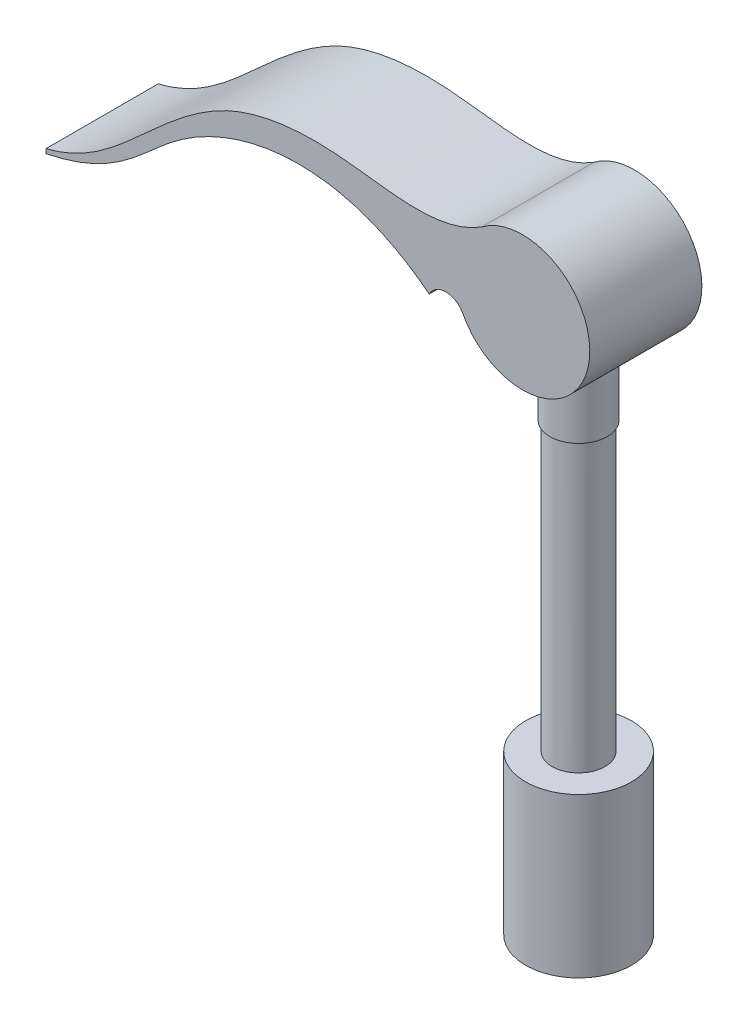
ISO-10303-21;
HEADER;
FILE_DESCRIPTION(('STEP AP214'),'2;1');
FILE_NAME('part.step','',(''),(''),'','','');
FILE_SCHEMA(('AUTOMOTIVE_DESIGN { 1 0 10303 214 1 1 1 1 }'));
ENDSEC;
DATA;
#1=APPLICATION_CONTEXT('core data for automotive mechanical design processes');
#2=APPLICATION_PROTOCOL_DEFINITION('international standard','automotive_design',2000,#1);
#3=PRODUCT_CONTEXT('',#1,'mechanical');
#4=PRODUCT('Part','Part','',(#3));
#5=PRODUCT_RELATED_PRODUCT_CATEGORY('part','',(#4));
#6=PRODUCT_DEFINITION_FORMATION('','',#4);
#7=PRODUCT_DEFINITION_CONTEXT('part definition',#1,'design');
#8=PRODUCT_DEFINITION('design','',#6,#7);
#9=PRODUCT_DEFINITION_SHAPE('','',#8);
#10=(LENGTH_UNIT() NAMED_UNIT(*) SI_UNIT(.MILLI.,.METRE.));
#11=(NAMED_UNIT(*) PLANE_ANGLE_UNIT() SI_UNIT($,.RADIAN.));
#12=(NAMED_UNIT(*) SI_UNIT($,.STERADIAN.) SOLID_ANGLE_UNIT());
#13=UNCERTAINTY_MEASURE_WITH_UNIT(LENGTH_MEASURE(1.E-05),#10,'distance_accuracy_value','');
#14=(GEOMETRIC_REPRESENTATION_CONTEXT(3) GLOBAL_UNCERTAINTY_ASSIGNED_CONTEXT((#13)) GLOBAL_UNIT_ASSIGNED_CONTEXT((#10,
#11,#12)) REPRESENTATION_CONTEXT('',''));
#15=CARTESIAN_POINT('',(0.,0.,0.));
#16=DIRECTION('',(0.,0.,1.));
#17=DIRECTION('',(1.,0.,0.));
#18=AXIS2_PLACEMENT_3D('',#15,#16,#17);
#19=CARTESIAN_POINT('',(0.,32.5,0.));
#20=DIRECTION('',(0.,-1.,0.));
#21=DIRECTION('',(0.,0.,-1.));
#22=AXIS2_PLACEMENT_3D('',#19,#20,#21);
#23=CYLINDRICAL_SURFACE('',#22,3.);
#24=CARTESIAN_POINT('',(0.,18.,0.));
#25=DIRECTION('',(0.,1.,0.));
#26=DIRECTION('',(0.,0.,1.));
#27=AXIS2_PLACEMENT_3D('',#24,#25,#26);
#28=CIRCLE('',#27,3.);
#29=CARTESIAN_POINT('',(0.,18.,3.));
#30=VERTEX_POINT('',#29);
#31=EDGE_CURVE('E47',#30,#30,#28,.T.);
#32=ORIENTED_EDGE('',*,*,#31,.F.);
#33=EDGE_LOOP('',(#32));
#34=FACE_BOUND('',#33,.T.);
#35=CARTESIAN_POINT('',(0.,-14.5,0.));
#36=DIRECTION('',(0.,-1.,0.));
#37=DIRECTION('',(0.,0.,-1.));
#38=AXIS2_PLACEMENT_3D('',#35,#36,#37);
#39=CIRCLE('',#38,3.);
#40=CARTESIAN_POINT('',(0.,-14.5,-3.));
#41=VERTEX_POINT('',#40);
#42=EDGE_CURVE('E11',#41,#41,#39,.T.);
#43=ORIENTED_EDGE('',*,*,#42,.F.);
#44=EDGE_LOOP('',(#43));
#45=FACE_BOUND('',#44,.T.);
#46=ADVANCED_FACE('F39',(#34,#45),#23,.T.);
#47=CARTESIAN_POINT('',(0.,31.75,6.35));
#48=DIRECTION('',(0.,0.,-1.));
#49=DIRECTION('',(-1.,0.,0.));
#50=AXIS2_PLACEMENT_3D('',#47,#48,#49);
#51=CYLINDRICAL_SURFACE('',#50,7.62);
#52=CARTESIAN_POINT('',(0.,31.75,-6.35));
#53=DIRECTION('',(0.,0.,1.));
#54=DIRECTION('',(1.,0.,0.));
#55=AXIS2_PLACEMENT_3D('',#52,#53,#54);
#56=CIRCLE('',#55,7.62);
#57=CARTESIAN_POINT('',(-6.76685080650134,28.2465545298161,-6.35));
#58=VERTEX_POINT('',#57);
#59=CARTESIAN_POINT('',(-4.61588431794142,37.8128386060807,-6.35));
#60=VERTEX_POINT('',#59);
#61=EDGE_CURVE('E106',#58,#60,#56,.T.);
#62=ORIENTED_EDGE('',*,*,#61,.T.);
#63=DIRECTION('',(0.,0.,-1.));
#64=VECTOR('',#63,1.);
#65=CARTESIAN_POINT('',(-4.61588431794142,37.8128386060807,6.35));
#66=LINE('',#65,#64);
#67=CARTESIAN_POINT('',(-4.61588431794142,37.8128386060807,6.35));
#68=VERTEX_POINT('',#67);
#69=EDGE_CURVE('E102',#68,#60,#66,.T.);
#70=ORIENTED_EDGE('',*,*,#69,.F.);
#71=CARTESIAN_POINT('',(0.,31.75,6.35));
#72=DIRECTION('',(0.,0.,1.));
#73=DIRECTION('',(1.,0.,0.));
#74=AXIS2_PLACEMENT_3D('',#71,#72,#73);
#75=CIRCLE('',#74,7.62);
#76=CARTESIAN_POINT('',(-6.76685080650134,28.2465545298161,6.35));
#77=VERTEX_POINT('',#76);
#78=EDGE_CURVE('E94',#77,#68,#75,.T.);
#79=ORIENTED_EDGE('',*,*,#78,.F.);
#80=DIRECTION('',(0.,0.,-1.));
#81=VECTOR('',#80,1.);
#82=CARTESIAN_POINT('',(-6.76685080650134,28.2465545298161,6.35));
#83=LINE('',#82,#81);
#84=EDGE_CURVE('E107',#77,#58,#83,.T.);
#85=ORIENTED_EDGE('',*,*,#84,.T.);
#86=EDGE_LOOP('',(#62,#70,#79,#85));
#87=FACE_BOUND('',#86,.T.);
#88=CARTESIAN_POINT('',(0.,24.13,-3.25));
#89=CARTESIAN_POINT('',(0.0869022796301108,24.1300007573351,-3.24999898281488));
#90=CARTESIAN_POINT('',(0.173835501103019,24.1314921741039,-3.24650738274284));
#91=CARTESIAN_POINT('',(0.347059295772381,24.1374123746472,-3.23258735601897));
#92=CARTESIAN_POINT('',(0.433349436987839,24.1418429794929,-3.22215462875045));
#93=CARTESIAN_POINT('',(0.690614639519566,24.1594209126001,-3.18051668259003));
#94=CARTESIAN_POINT('',(0.859757942773251,24.1768539586946,-3.13897200729109));
#95=CARTESIAN_POINT('',(1.18742393555538,24.2212704635141,-3.03022941764263));
#96=CARTESIAN_POINT('',(1.34598109865787,24.248220923628,-2.96312007815665));
#97=CARTESIAN_POINT('',(1.64946437168281,24.3090582251664,-2.80552850173628));
#98=CARTESIAN_POINT('',(1.79439423520778,24.3429431482949,-2.71505272690092));
#99=CARTESIAN_POINT('',(2.07424760098003,24.4162543819317,-2.50832518367819));
#100=CARTESIAN_POINT('',(2.20836600087772,24.4558677285343,-2.39105116927244));
#101=CARTESIAN_POINT('',(2.45573226319711,24.5353836205868,-2.13622034930785));
#102=CARTESIAN_POINT('',(2.56896864454639,24.5752863126653,-1.99865246040941));
#103=CARTESIAN_POINT('',(2.77719577389056,24.6531979972419,-1.69845593009673));
#104=CARTESIAN_POINT('',(2.87092781408468,24.6909998665983,-1.53489477493343));
#105=CARTESIAN_POINT('',(3.02919025104067,24.7574448186285,-1.19248617898951));
#106=CARTESIAN_POINT('',(3.09373639726797,24.7860928385027,-1.01364704470078));
#107=CARTESIAN_POINT('',(3.18843167806702,24.8289524246894,-0.655021620991987));
#108=CARTESIAN_POINT('',(3.22013330067796,24.8438117099593,-0.475725755750216));
#109=CARTESIAN_POINT('',(3.25307839055376,24.8592636197371,-0.11379137850182));
#110=CARTESIAN_POINT('',(3.25433983196981,24.8598646633698,0.068845097192371));
#111=CARTESIAN_POINT('',(3.2275339386748,24.8472776621911,0.416461336474631));
#112=CARTESIAN_POINT('',(3.20183553251833,24.8352033300541,0.581672370522845));
#113=CARTESIAN_POINT('',(3.12582736013491,24.8005158624423,0.905163975840491));
#114=CARTESIAN_POINT('',(3.07551260980753,24.7779005927752,1.06344313653146));
#115=CARTESIAN_POINT('',(2.95071005816976,24.7241623752635,1.37267137132385));
#116=CARTESIAN_POINT('',(2.8757205714702,24.6928651784668,1.5233863188295));
#117=CARTESIAN_POINT('',(2.70405379855692,24.625325417662,1.81069796310545));
#118=CARTESIAN_POINT('',(2.60736773860817,24.5890808553503,1.9472889156326));
#119=CARTESIAN_POINT('',(2.38496314175199,24.5118105518634,2.21526446763649));
#120=CARTESIAN_POINT('',(2.25742710457659,24.4706463027702,2.34510511206012));
#121=CARTESIAN_POINT('',(1.98200315734941,24.3908827712723,2.58208790802629));
#122=CARTESIAN_POINT('',(1.83411003375197,24.3522841497042,2.68922422697635));
#123=CARTESIAN_POINT('',(1.51728670587494,24.2807809191207,2.88017070505495));
#124=CARTESIAN_POINT('',(1.34791983048349,24.2480445667711,2.9633240469807));
#125=CARTESIAN_POINT('',(0.995847521040362,24.1932584542917,3.09941086891308));
#126=CARTESIAN_POINT('',(0.813149889810535,24.1712024994905,3.15236186957148));
#127=CARTESIAN_POINT('',(0.452480032696547,24.1414366572489,3.22324282191011));
#128=CARTESIAN_POINT('',(0.274984529842222,24.1328802874573,3.24324301045264));
#129=CARTESIAN_POINT('',(-0.0810196315538367,24.1283540919455,3.25386231675789));
#130=CARTESIAN_POINT('',(-0.259527964721461,24.1323804298071,3.24449038996105));
#131=CARTESIAN_POINT('',(-0.602604849577726,24.1520220687169,3.1980875979531));
#132=CARTESIAN_POINT('',(-0.767413052616727,24.167017418121,3.16253569205905));
#133=CARTESIAN_POINT('',(-1.08852936680579,24.206413977503,3.06686859237573));
#134=CARTESIAN_POINT('',(-1.24483641452852,24.2308163611525,3.00675033350111));
#135=CARTESIAN_POINT('',(-1.55003114749842,24.2876503656217,2.8617028601522));
#136=CARTESIAN_POINT('',(-1.69853501989328,24.3203088100028,2.77605785299441));
#137=CARTESIAN_POINT('',(-1.97959802819863,24.3902037982795,2.58317131758282));
#138=CARTESIAN_POINT('',(-2.11215034244339,24.427442287158,2.47592060172938));
#139=CARTESIAN_POINT('',(-2.36796654501948,24.5059436174294,2.23350747098614));
#140=CARTESIAN_POINT('',(-2.48979690266163,24.5472992821728,2.09685850798146));
#141=CARTESIAN_POINT('',(-2.70922565469588,24.6269279816728,1.80444440920642));
#142=CARTESIAN_POINT('',(-2.80681753445412,24.6652001858169,1.64867415093302));
#143=CARTESIAN_POINT('',(-2.97634575379863,24.7347066901706,1.31865320314582));
#144=CARTESIAN_POINT('',(-3.04780969630729,24.7658079679558,1.14412971676169));
#145=CARTESIAN_POINT('',(-3.15970035038361,24.8157000557439,0.783775659264133));
#146=CARTESIAN_POINT('',(-3.20015431214238,24.8345016720069,0.597955170819593));
#147=CARTESIAN_POINT('',(-3.2461085535076,24.8559617447582,0.236264417408513));
#148=CARTESIAN_POINT('',(-3.25414154425207,24.8597891662421,0.0607841423737469));
#149=CARTESIAN_POINT('',(-3.24185312826355,24.8539984020055,-0.288935890081247));
#150=CARTESIAN_POINT('',(-3.22153660255225,24.8443825308565,-0.463175855858207));
#151=CARTESIAN_POINT('',(-3.15528658451569,24.8138786035097,-0.796269082694187));
#152=CARTESIAN_POINT('',(-3.11071491375475,24.7935915516769,-0.955453649597627));
#153=CARTESIAN_POINT('',(-2.99858667268494,24.7445305617055,-1.26410354398331));
#154=CARTESIAN_POINT('',(-2.93102358067623,24.7157542158196,-1.41356609939491));
#155=CARTESIAN_POINT('',(-2.77004500170049,24.6507592636966,-1.70859965184645));
#156=CARTESIAN_POINT('',(-2.67529228469461,24.6141911644663,-1.85336239030096));
#157=CARTESIAN_POINT('',(-2.46444050491776,24.5386576605332,-2.12572630708218));
#158=CARTESIAN_POINT('',(-2.34833348554529,24.4996913658768,-2.2533210578394));
#159=CARTESIAN_POINT('',(-2.08738781151043,24.4201138507991,-2.4979479414693));
#160=CARTESIAN_POINT('',(-1.94101624989863,24.3796106623501,-2.61338495648186));
#161=CARTESIAN_POINT('',(-1.62939772445302,24.3045281080428,-2.81820265576435));
#162=CARTESIAN_POINT('',(-1.46414224753146,24.2699514316241,-2.90757152320217));
#163=CARTESIAN_POINT('',(-1.206903958519,24.2256878264369,-3.01902114234785));
#164=CARTESIAN_POINT('',(-1.12023686375883,24.2122682079262,-3.05224820342424));
#165=CARTESIAN_POINT('',(-0.94404512192376,24.1881841198373,-3.11125241710559));
#166=CARTESIAN_POINT('',(-0.854521858584249,24.1775183382077,-3.137033118188));
#167=CARTESIAN_POINT('',(-0.673525754596517,24.1592804642332,-3.18080436948379));
#168=CARTESIAN_POINT('',(-0.582058259361703,24.1517008161684,-3.19881395212111));
#169=CARTESIAN_POINT('',(-0.397748620149877,24.139828567248,-3.22691390490266));
#170=CARTESIAN_POINT('',(-0.304907515498043,24.1355335989474,-3.237009978868));
#171=CARTESIAN_POINT('',(-0.176548923565274,24.1319636839399,-3.24539363609467));
#172=CARTESIAN_POINT('',(-0.141266852198628,24.1312277835847,-3.24712045093776));
#173=CARTESIAN_POINT('',(-0.0706582255876664,24.130245786297,-3.24942384287012));
#174=CARTESIAN_POINT('',(-0.0353316700967549,24.1299996920919,-3.25000041355474));
#175=CARTESIAN_POINT('',(0.,24.13,-3.25));
#176=B_SPLINE_CURVE_WITH_KNOTS('',3,(#88,#89,#90,#91,#92,#93,#94,#95,#96,#97,#98,#99,#100,#101,
#102,#103,#104,#105,#106,#107,#108,#109,#110,#111,#112,#113,#114,#115,#116,#117,#118,#119,#120,
#121,#122,#123,#124,#125,#126,#127,#128,#129,#130,#131,#132,#133,#134,#135,#136,#137,#138,#139,
#140,#141,#142,#143,#144,#145,#146,#147,#148,#149,#150,#151,#152,#153,#154,#155,#156,#157,#158,
#159,#160,#161,#162,#163,#164,#165,#166,#167,#168,#169,#170,#171,#172,#173,#174,#175),
.UNSPECIFIED.,.T.,.F.,(4,2,2,2,2,2,2,2,2,2,2,2,2,2,2,2,2,2,2,2,2,2,2,2,2,2,2,2,2,2,2,2,2,2,2,2,
2,2,2,2,2,2,2,4),(0.,0.260668160403108,0.521497977419044,1.04382816826874,1.56436484375683,
2.08475771621365,2.62993054176306,3.17540221907362,3.74930641052107,4.3229005377034,
4.86793800603455,5.41265363575165,5.91321786068549,6.41388347742122,6.92543227575003,
7.43718830991647,7.9944672690986,8.55188921651521,9.12337686466191,9.6945326495843,
10.2282058996099,10.7617164506284,11.2671984444528,11.7727435253278,12.2940667113163,
12.8156120542307,13.3761173977271,13.9367732269588,14.5071158091913,15.076956623359,
15.6013037482558,16.125560605866,16.6230327871126,17.1206461980961,17.648943680154,
18.1774384058242,18.7470680120978,19.3169554346891,19.5979933367506,19.8788970916252,
20.1591089190563,20.4391185919573,20.5450972867224,20.6510765715846),.UNSPECIFIED.);
#177=CARTESIAN_POINT('',(0.,24.13,-3.25));
#178=VERTEX_POINT('',#177);
#179=EDGE_CURVE('E135',#178,#178,#176,.T.);
#180=ORIENTED_EDGE('',*,*,#179,.F.);
#181=EDGE_LOOP('',(#180));
#182=FACE_BOUND('',#181,.T.);
#183=ADVANCED_FACE('F103',(#87,#182),#51,.T.);
#184=CARTESIAN_POINT('',(-53.975,20.32,6.35));
#185=CARTESIAN_POINT('',(-46.1216701966929,21.8950484914049,6.35));
#186=CARTESIAN_POINT('',(-37.2727952233673,34.1420140889996,6.35));
#187=CARTESIAN_POINT('',(-20.2627037332868,35.94817115014,6.35));
#188=CARTESIAN_POINT('',(-10.5768508065013,28.2465545298161,6.35));
#189=B_SPLINE_CURVE_WITH_KNOTS('',3,(#184,#185,#186,#187,#188),.UNSPECIFIED.,.F.,.F.,(4,1,4),
(0.,0.32030610219285,1.),.UNSPECIFIED.);
#190=DIRECTION('',(0.,0.,-1.));
#191=VECTOR('',#190,1.);
#192=SURFACE_OF_LINEAR_EXTRUSION('',#189,#191);
#193=CARTESIAN_POINT('',(-53.975,20.32,-6.35));
#194=CARTESIAN_POINT('',(-46.1216701966929,21.8950484914049,-6.35));
#195=CARTESIAN_POINT('',(-37.2727952233673,34.1420140889996,-6.35));
#196=CARTESIAN_POINT('',(-20.2627037332868,35.94817115014,-6.35));
#197=CARTESIAN_POINT('',(-10.5768508065013,28.2465545298161,-6.35));
#198=B_SPLINE_CURVE_WITH_KNOTS('',3,(#193,#194,#195,#196,#197),.UNSPECIFIED.,.F.,.F.,(4,1,4),
(0.,0.32030610219285,1.),.UNSPECIFIED.);
#199=CARTESIAN_POINT('',(-53.975,20.32,-6.35));
#200=VERTEX_POINT('',#199);
#201=CARTESIAN_POINT('',(-10.5768508065013,28.2465545298161,-6.35));
#202=VERTEX_POINT('',#201);
#203=EDGE_CURVE('E185',#200,#202,#198,.T.);
#204=ORIENTED_EDGE('',*,*,#203,.T.);
#205=DIRECTION('',(0.,0.,-1.));
#206=VECTOR('',#205,1.);
#207=CARTESIAN_POINT('',(-10.5768508065013,28.2465545298161,6.35));
#208=LINE('',#207,#206);
#209=CARTESIAN_POINT('',(-10.5768508065013,28.2465545298161,6.35));
#210=VERTEX_POINT('',#209);
#211=EDGE_CURVE('E142',#210,#202,#208,.T.);
#212=ORIENTED_EDGE('',*,*,#211,.F.);
#213=CARTESIAN_POINT('',(-53.975,20.32,6.35));
#214=VERTEX_POINT('',#213);
#215=EDGE_CURVE('E190',#214,#210,#189,.T.);
#216=ORIENTED_EDGE('',*,*,#215,.F.);
#217=DIRECTION('',(0.,0.,-1.));
#218=VECTOR('',#217,1.);
#219=CARTESIAN_POINT('',(-53.975,20.32,6.35));
#220=LINE('',#219,#218);
#221=EDGE_CURVE('E112',#214,#200,#220,.T.);
#222=ORIENTED_EDGE('',*,*,#221,.T.);
#223=EDGE_LOOP('',(#204,#212,#216,#222));
#224=FACE_BOUND('',#223,.T.);
#225=ADVANCED_FACE('F132',(#224),#192,.F.);
#226=CARTESIAN_POINT('',(-8.67185080650134,27.2602665486642,6.35));
#227=DIRECTION('',(0.,0.,-1.));
#228=DIRECTION('',(-1.,0.,0.));
#229=AXIS2_PLACEMENT_3D('',#226,#227,#228);
#230=CYLINDRICAL_SURFACE('',#229,2.1451780769355);
#231=CARTESIAN_POINT('',(-8.67185080650134,27.2602665486642,-6.35));
#232=DIRECTION('',(0.,0.,-1.));
#233=DIRECTION('',(-1.,0.,0.));
#234=AXIS2_PLACEMENT_3D('',#231,#232,#233);
#235=CIRCLE('',#234,2.1451780769355);
#236=EDGE_CURVE('E256',#202,#58,#235,.T.);
#237=ORIENTED_EDGE('',*,*,#236,.T.);
#238=ORIENTED_EDGE('',*,*,#84,.F.);
#239=CARTESIAN_POINT('',(-8.67185080650134,27.2602665486642,6.35));
#240=DIRECTION('',(0.,0.,-1.));
#241=DIRECTION('',(-1.,0.,0.));
#242=AXIS2_PLACEMENT_3D('',#239,#240,#241);
#243=CIRCLE('',#242,2.1451780769355);
#244=EDGE_CURVE('E90',#210,#77,#243,.T.);
#245=ORIENTED_EDGE('',*,*,#244,.F.);
#246=ORIENTED_EDGE('',*,*,#211,.T.);
#247=EDGE_LOOP('',(#237,#238,#245,#246));
#248=FACE_BOUND('',#247,.T.);
#249=ADVANCED_FACE('F127',(#248),#230,.F.);
#250=CARTESIAN_POINT('',(-4.61588431794142,37.8128386060807,6.35));
#251=CARTESIAN_POINT('',(-9.80514238736231,34.5284282826278,6.35));
#252=CARTESIAN_POINT('',(-19.4459031712702,37.6014320978626,6.35));
#253=CARTESIAN_POINT('',(-32.7075816345255,36.2172359433677,6.35));
#254=CARTESIAN_POINT('',(-42.739180183691,28.4513048626195,6.35));
#255=CARTESIAN_POINT('',(-48.5790844726061,22.1042618634815,6.35));
#256=CARTESIAN_POINT('',(-53.975,20.828,6.35));
#257=B_SPLINE_CURVE_WITH_KNOTS('',3,(#250,#251,#252,#253,#254,#255,#256),.UNSPECIFIED.,.F.,.F.,
(4,1,1,1,4),(0.,0.315076225938667,0.527719807770678,0.709086644501504,1.),.UNSPECIFIED.);
#258=DIRECTION('',(0.,0.,-1.));
#259=VECTOR('',#258,1.);
#260=SURFACE_OF_LINEAR_EXTRUSION('',#257,#259);
#261=CARTESIAN_POINT('',(-4.61588431794142,37.8128386060807,-6.35));
#262=CARTESIAN_POINT('',(-9.80514238736231,34.5284282826278,-6.35));
#263=CARTESIAN_POINT('',(-19.4459031712702,37.6014320978626,-6.35));
#264=CARTESIAN_POINT('',(-32.7075816345255,36.2172359433677,-6.35));
#265=CARTESIAN_POINT('',(-42.739180183691,28.4513048626195,-6.35));
#266=CARTESIAN_POINT('',(-48.5790844726061,22.1042618634815,-6.35));
#267=CARTESIAN_POINT('',(-53.975,20.828,-6.35));
#268=B_SPLINE_CURVE_WITH_KNOTS('',3,(#261,#262,#263,#264,#265,#266,#267),.UNSPECIFIED.,.F.,.F.,
(4,1,1,1,4),(0.,0.315076225938667,0.527719807770678,0.709086644501504,1.),.UNSPECIFIED.);
#269=CARTESIAN_POINT('',(-53.975,20.828,-6.35));
#270=VERTEX_POINT('',#269);
#271=EDGE_CURVE('E75',#60,#270,#268,.T.);
#272=ORIENTED_EDGE('',*,*,#271,.T.);
#273=DIRECTION('',(0.,0.,-1.));
#274=VECTOR('',#273,1.);
#275=CARTESIAN_POINT('',(-53.975,20.828,6.35));
#276=LINE('',#275,#274);
#277=CARTESIAN_POINT('',(-53.975,20.828,6.35));
#278=VERTEX_POINT('',#277);
#279=EDGE_CURVE('E108',#278,#270,#276,.T.);
#280=ORIENTED_EDGE('',*,*,#279,.F.);
#281=EDGE_CURVE('E98',#68,#278,#257,.T.);
#282=ORIENTED_EDGE('',*,*,#281,.F.);
#283=ORIENTED_EDGE('',*,*,#69,.T.);
#284=EDGE_LOOP('',(#272,#280,#282,#283));
#285=FACE_BOUND('',#284,.T.);
#286=ADVANCED_FACE('F110',(#285),#260,.F.);
#287=CARTESIAN_POINT('',(-53.975,20.32,6.35));
#288=DIRECTION('',(1.,0.,0.));
#289=DIRECTION('',(0.,0.,-1.));
#290=AXIS2_PLACEMENT_3D('',#287,#288,#289);
#291=PLANE('',#290);
#292=DIRECTION('',(0.,-1.,0.));
#293=VECTOR('',#292,1.);
#294=CARTESIAN_POINT('',(-53.975,20.32,-6.35));
#295=LINE('',#294,#293);
#296=EDGE_CURVE('E81',#270,#200,#295,.T.);
#297=ORIENTED_EDGE('',*,*,#296,.T.);
#298=ORIENTED_EDGE('',*,*,#221,.F.);
#299=DIRECTION('',(0.,-1.,0.));
#300=VECTOR('',#299,1.);
#301=CARTESIAN_POINT('',(-53.975,20.32,6.35));
#302=LINE('',#301,#300);
#303=EDGE_CURVE('E55',#278,#214,#302,.T.);
#304=ORIENTED_EDGE('',*,*,#303,.F.);
#305=ORIENTED_EDGE('',*,*,#279,.T.);
#306=EDGE_LOOP('',(#297,#298,#304,#305));
#307=FACE_BOUND('',#306,.T.);
#308=ADVANCED_FACE('F126',(#307),#291,.F.);
#309=CARTESIAN_POINT('',(-32.749947796734,32.3814423109919,6.35));
#310=DIRECTION('',(0.,0.,-1.));
#311=DIRECTION('',(-1.,0.,0.));
#312=AXIS2_PLACEMENT_3D('',#309,#310,#311);
#313=PLANE('',#312);
#314=ORIENTED_EDGE('',*,*,#215,.T.);
#315=ORIENTED_EDGE('',*,*,#244,.T.);
#316=ORIENTED_EDGE('',*,*,#78,.T.);
#317=ORIENTED_EDGE('',*,*,#281,.T.);
#318=ORIENTED_EDGE('',*,*,#303,.T.);
#319=EDGE_LOOP('',(#314,#315,#316,#317,#318));
#320=FACE_BOUND('',#319,.T.);
#321=ADVANCED_FACE('F96',(#320),#313,.F.);
#322=CARTESIAN_POINT('',(-32.749947796734,32.3814423109919,-6.35));
#323=DIRECTION('',(0.,0.,-1.));
#324=DIRECTION('',(-1.,0.,0.));
#325=AXIS2_PLACEMENT_3D('',#322,#323,#324);
#326=PLANE('',#325);
#327=ORIENTED_EDGE('',*,*,#203,.F.);
#328=ORIENTED_EDGE('',*,*,#296,.F.);
#329=ORIENTED_EDGE('',*,*,#271,.F.);
#330=ORIENTED_EDGE('',*,*,#61,.F.);
#331=ORIENTED_EDGE('',*,*,#236,.F.);
#332=EDGE_LOOP('',(#327,#328,#329,#330,#331));
#333=FACE_BOUND('',#332,.T.);
#334=ADVANCED_FACE('F154',(#333),#326,.T.);
#335=CARTESIAN_POINT('',(0.,18.,0.));
#336=DIRECTION('',(0.,1.,0.));
#337=DIRECTION('',(0.,0.,1.));
#338=AXIS2_PLACEMENT_3D('',#335,#336,#337);
#339=PLANE('',#338);
#340=ORIENTED_EDGE('',*,*,#31,.T.);
#341=EDGE_LOOP('',(#340));
#342=FACE_BOUND('',#341,.T.);
#343=CARTESIAN_POINT('',(0.,18.,0.));
#344=DIRECTION('',(0.,1.,0.));
#345=DIRECTION('',(0.,0.,1.));
#346=AXIS2_PLACEMENT_3D('',#343,#344,#345);
#347=CIRCLE('',#346,3.25);
#348=CARTESIAN_POINT('',(0.,18.,3.25));
#349=VERTEX_POINT('',#348);
#350=EDGE_CURVE('E181',#349,#349,#347,.T.);
#351=ORIENTED_EDGE('',*,*,#350,.F.);
#352=EDGE_LOOP('',(#351));
#353=FACE_BOUND('',#352,.T.);
#354=ADVANCED_FACE('F150',(#342,#353),#339,.F.);
#355=CARTESIAN_POINT('',(0.,39.371,0.));
#356=DIRECTION('',(0.,-1.,0.));
#357=DIRECTION('',(0.,0.,-1.));
#358=AXIS2_PLACEMENT_3D('',#355,#356,#357);
#359=CYLINDRICAL_SURFACE('',#358,3.25);
#360=ORIENTED_EDGE('',*,*,#350,.T.);
#361=EDGE_LOOP('',(#360));
#362=FACE_BOUND('',#361,.T.);
#363=ORIENTED_EDGE('',*,*,#179,.T.);
#364=EDGE_LOOP('',(#363));
#365=FACE_BOUND('',#364,.T.);
#366=ADVANCED_FACE('F144',(#362,#365),#359,.T.);
#367=CARTESIAN_POINT('',(0.,-14.5,0.));
#368=DIRECTION('',(0.,-1.,0.));
#369=DIRECTION('',(0.,0.,-1.));
#370=AXIS2_PLACEMENT_3D('',#367,#368,#369);
#371=CYLINDRICAL_SURFACE('',#370,6.);
#372=CARTESIAN_POINT('',(0.,-14.5,0.));
#373=DIRECTION('',(0.,-1.,0.));
#374=DIRECTION('',(0.,0.,-1.));
#375=AXIS2_PLACEMENT_3D('',#372,#373,#374);
#376=CIRCLE('',#375,6.);
#377=CARTESIAN_POINT('',(0.,-14.5,-6.));
#378=VERTEX_POINT('',#377);
#379=EDGE_CURVE('E179',#378,#378,#376,.T.);
#380=ORIENTED_EDGE('',*,*,#379,.T.);
#381=EDGE_LOOP('',(#380));
#382=FACE_BOUND('',#381,.T.);
#383=CARTESIAN_POINT('',(0.,-32.5,0.));
#384=DIRECTION('',(0.,-1.,0.));
#385=DIRECTION('',(0.,0.,-1.));
#386=AXIS2_PLACEMENT_3D('',#383,#384,#385);
#387=CIRCLE('',#386,6.);
#388=CARTESIAN_POINT('',(0.,-32.5,-6.));
#389=VERTEX_POINT('',#388);
#390=EDGE_CURVE('E182',#389,#389,#387,.T.);
#391=ORIENTED_EDGE('',*,*,#390,.F.);
#392=EDGE_LOOP('',(#391));
#393=FACE_BOUND('',#392,.T.);
#394=ADVANCED_FACE('F149',(#382,#393),#371,.T.);
#395=CARTESIAN_POINT('',(0.,-14.5,0.));
#396=DIRECTION('',(0.,-1.,0.));
#397=DIRECTION('',(0.,0.,-1.));
#398=AXIS2_PLACEMENT_3D('',#395,#396,#397);
#399=PLANE('',#398);
#400=ORIENTED_EDGE('',*,*,#42,.T.);
#401=EDGE_LOOP('',(#400));
#402=FACE_BOUND('',#401,.T.);
#403=ORIENTED_EDGE('',*,*,#379,.F.);
#404=EDGE_LOOP('',(#403));
#405=FACE_BOUND('',#404,.T.);
#406=ADVANCED_FACE('F172',(#402,#405),#399,.F.);
#407=CARTESIAN_POINT('',(0.,-32.5,0.));
#408=DIRECTION('',(0.,1.,0.));
#409=DIRECTION('',(0.,0.,1.));
#410=AXIS2_PLACEMENT_3D('',#407,#408,#409);
#411=PLANE('',#410);
#412=ORIENTED_EDGE('',*,*,#390,.T.);
#413=EDGE_LOOP('',(#412));
#414=FACE_BOUND('',#413,.T.);
#415=ADVANCED_FACE('F175',(#414),#411,.F.);
#416=CLOSED_SHELL('',(#46,#183,#225,#249,#286,#308,#321,#334,#354,#366,#394,#406,#415));
#417=MANIFOLD_SOLID_BREP('B2',#416);
#418=ADVANCED_BREP_SHAPE_REPRESENTATION('',(#18,#417),#14);
#419=SHAPE_DEFINITION_REPRESENTATION(#9,#418);
ENDSEC;
END-ISO-10303-21;
